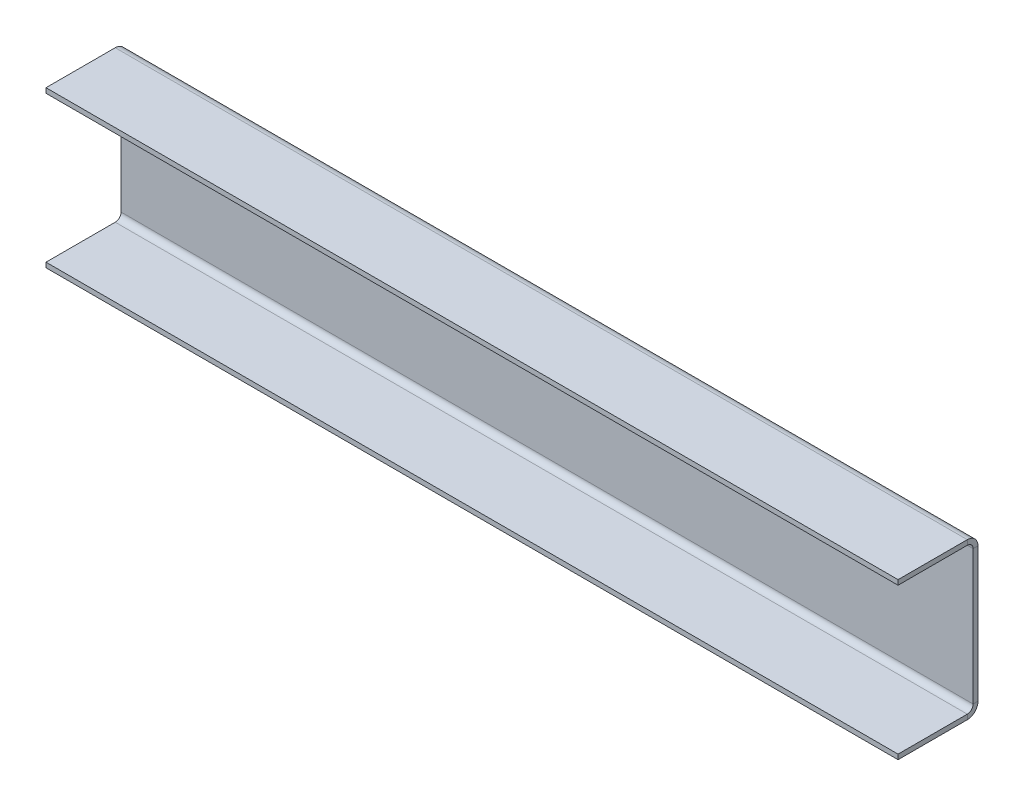
ISO-10303-21;
HEADER;
FILE_DESCRIPTION(('STEP AP214'),'2;1');
FILE_NAME('part.step','',(''),(''),'','','');
FILE_SCHEMA(('AUTOMOTIVE_DESIGN { 1 0 10303 214 1 1 1 1 }'));
ENDSEC;
DATA;
#1=APPLICATION_CONTEXT('core data for automotive mechanical design processes');
#2=APPLICATION_PROTOCOL_DEFINITION('international standard','automotive_design',2000,#1);
#3=PRODUCT_CONTEXT('',#1,'mechanical');
#4=PRODUCT('Part','Part','',(#3));
#5=PRODUCT_RELATED_PRODUCT_CATEGORY('part','',(#4));
#6=PRODUCT_DEFINITION_FORMATION('','',#4);
#7=PRODUCT_DEFINITION_CONTEXT('part definition',#1,'design');
#8=PRODUCT_DEFINITION('design','',#6,#7);
#9=PRODUCT_DEFINITION_SHAPE('','',#8);
#10=(LENGTH_UNIT() NAMED_UNIT(*) SI_UNIT(.MILLI.,.METRE.));
#11=(NAMED_UNIT(*) PLANE_ANGLE_UNIT() SI_UNIT($,.RADIAN.));
#12=(NAMED_UNIT(*) SI_UNIT($,.STERADIAN.) SOLID_ANGLE_UNIT());
#13=UNCERTAINTY_MEASURE_WITH_UNIT(LENGTH_MEASURE(1.E-05),#10,'distance_accuracy_value','');
#14=(GEOMETRIC_REPRESENTATION_CONTEXT(3) GLOBAL_UNCERTAINTY_ASSIGNED_CONTEXT((#13)) GLOBAL_UNIT_ASSIGNED_CONTEXT((#10,
#11,#12)) REPRESENTATION_CONTEXT('',''));
#15=CARTESIAN_POINT('',(0.,0.,0.));
#16=DIRECTION('',(0.,0.,1.));
#17=DIRECTION('',(1.,0.,0.));
#18=AXIS2_PLACEMENT_3D('',#15,#16,#17);
#19=CARTESIAN_POINT('',(0.,0.,-2.5));
#20=DIRECTION('',(0.,0.,1.));
#21=DIRECTION('',(1.,0.,0.));
#22=AXIS2_PLACEMENT_3D('',#19,#20,#21);
#23=PLANE('',#22);
#24=DIRECTION('',(1.,0.,0.));
#25=VECTOR('',#24,1.);
#26=CARTESIAN_POINT('',(218.5,-34.5,-2.50000000000002));
#27=LINE('',#26,#25);
#28=CARTESIAN_POINT('',(218.5,-34.5,-2.50000000000002));
#29=VERTEX_POINT('',#28);
#30=CARTESIAN_POINT('',(-218.5,-34.5,-2.5));
#31=VERTEX_POINT('',#30);
#32=EDGE_CURVE('E212',#29,#31,#27,.F.);
#33=ORIENTED_EDGE('',*,*,#32,.T.);
#34=DIRECTION('',(0.,-1.,0.));
#35=VECTOR('',#34,1.);
#36=CARTESIAN_POINT('',(-218.5,-40.,-2.5));
#37=LINE('',#36,#35);
#38=CARTESIAN_POINT('',(-218.5,34.5,-2.50000000000004));
#39=VERTEX_POINT('',#38);
#40=EDGE_CURVE('E89',#39,#31,#37,.T.);
#41=ORIENTED_EDGE('',*,*,#40,.F.);
#42=DIRECTION('',(-1.,0.,0.));
#43=VECTOR('',#42,1.);
#44=CARTESIAN_POINT('',(-218.5,34.5,-2.50000000000004));
#45=LINE('',#44,#43);
#46=CARTESIAN_POINT('',(218.5,34.5,-2.5));
#47=VERTEX_POINT('',#46);
#48=EDGE_CURVE('E265',#39,#47,#45,.F.);
#49=ORIENTED_EDGE('',*,*,#48,.T.);
#50=DIRECTION('',(0.,1.,0.));
#51=VECTOR('',#50,1.);
#52=CARTESIAN_POINT('',(218.5,-40.,-2.5));
#53=LINE('',#52,#51);
#54=EDGE_CURVE('E13',#29,#47,#53,.T.);
#55=ORIENTED_EDGE('',*,*,#54,.F.);
#56=EDGE_LOOP('',(#33,#41,#49,#55));
#57=FACE_BOUND('',#56,.T.);
#58=ADVANCED_FACE('F80',(#57),#23,.F.);
#59=CARTESIAN_POINT('',(0.,0.,0.));
#60=DIRECTION('',(0.,0.,1.));
#61=DIRECTION('',(1.,0.,0.));
#62=AXIS2_PLACEMENT_3D('',#59,#60,#61);
#63=PLANE('',#62);
#64=DIRECTION('',(0.,-1.,0.));
#65=VECTOR('',#64,1.);
#66=CARTESIAN_POINT('',(-218.5,-40.,0.));
#67=LINE('',#66,#65);
#68=CARTESIAN_POINT('',(-218.5,34.5,0.));
#69=VERTEX_POINT('',#68);
#70=CARTESIAN_POINT('',(-218.5,-34.5,0.));
#71=VERTEX_POINT('',#70);
#72=EDGE_CURVE('E283',#69,#71,#67,.T.);
#73=ORIENTED_EDGE('',*,*,#72,.T.);
#74=DIRECTION('',(1.,0.,0.));
#75=VECTOR('',#74,1.);
#76=CARTESIAN_POINT('',(218.5,-34.5,0.));
#77=LINE('',#76,#75);
#78=CARTESIAN_POINT('',(218.5,-34.5,0.));
#79=VERTEX_POINT('',#78);
#80=EDGE_CURVE('E224',#79,#71,#77,.F.);
#81=ORIENTED_EDGE('',*,*,#80,.F.);
#82=DIRECTION('',(0.,1.,0.));
#83=VECTOR('',#82,1.);
#84=CARTESIAN_POINT('',(218.5,-40.,0.));
#85=LINE('',#84,#83);
#86=CARTESIAN_POINT('',(218.5,34.5,0.));
#87=VERTEX_POINT('',#86);
#88=EDGE_CURVE('E84',#79,#87,#85,.T.);
#89=ORIENTED_EDGE('',*,*,#88,.T.);
#90=DIRECTION('',(-1.,0.,0.));
#91=VECTOR('',#90,1.);
#92=CARTESIAN_POINT('',(-218.5,34.5,0.));
#93=LINE('',#92,#91);
#94=EDGE_CURVE('E97',#69,#87,#93,.F.);
#95=ORIENTED_EDGE('',*,*,#94,.F.);
#96=EDGE_LOOP('',(#73,#81,#89,#95));
#97=FACE_BOUND('',#96,.T.);
#98=ADVANCED_FACE('F288',(#97),#63,.T.);
#99=CARTESIAN_POINT('',(218.5,-40.,-2.5));
#100=DIRECTION('',(1.,0.,0.));
#101=DIRECTION('',(0.,0.,-1.));
#102=AXIS2_PLACEMENT_3D('',#99,#100,#101);
#103=PLANE('',#102);
#104=ORIENTED_EDGE('',*,*,#88,.F.);
#105=DIRECTION('',(0.,0.,-1.));
#106=VECTOR('',#105,1.);
#107=CARTESIAN_POINT('',(218.5,-34.5,0.));
#108=LINE('',#107,#106);
#109=EDGE_CURVE('E218',#79,#29,#108,.T.);
#110=ORIENTED_EDGE('',*,*,#109,.T.);
#111=ORIENTED_EDGE('',*,*,#54,.T.);
#112=DIRECTION('',(0.,0.,-1.));
#113=VECTOR('',#112,1.);
#114=CARTESIAN_POINT('',(218.5,34.5,0.));
#115=LINE('',#114,#113);
#116=EDGE_CURVE('E280',#87,#47,#115,.T.);
#117=ORIENTED_EDGE('',*,*,#116,.F.);
#118=EDGE_LOOP('',(#104,#110,#111,#117));
#119=FACE_BOUND('',#118,.T.);
#120=ADVANCED_FACE('F290',(#119),#103,.T.);
#121=CARTESIAN_POINT('',(-218.5,-40.,-2.5));
#122=DIRECTION('',(-1.,0.,0.));
#123=DIRECTION('',(0.,0.,1.));
#124=AXIS2_PLACEMENT_3D('',#121,#122,#123);
#125=PLANE('',#124);
#126=DIRECTION('',(0.,0.,-1.));
#127=VECTOR('',#126,1.);
#128=CARTESIAN_POINT('',(-218.5,-34.5,0.));
#129=LINE('',#128,#127);
#130=EDGE_CURVE('E230',#71,#31,#129,.T.);
#131=ORIENTED_EDGE('',*,*,#130,.F.);
#132=ORIENTED_EDGE('',*,*,#72,.F.);
#133=DIRECTION('',(0.,0.,-1.));
#134=VECTOR('',#133,1.);
#135=CARTESIAN_POINT('',(-218.5,34.5,0.));
#136=LINE('',#135,#134);
#137=EDGE_CURVE('E271',#69,#39,#136,.T.);
#138=ORIENTED_EDGE('',*,*,#137,.T.);
#139=ORIENTED_EDGE('',*,*,#40,.T.);
#140=EDGE_LOOP('',(#131,#132,#138,#139));
#141=FACE_BOUND('',#140,.T.);
#142=ADVANCED_FACE('F82',(#141),#125,.T.);
#143=CARTESIAN_POINT('',(218.5,34.5,3.));
#144=DIRECTION('',(1.,0.,0.));
#145=DIRECTION('',(0.,0.,-1.));
#146=AXIS2_PLACEMENT_3D('',#143,#144,#145);
#147=PLANE('',#146);
#148=DIRECTION('',(0.,-1.,0.));
#149=VECTOR('',#148,1.);
#150=CARTESIAN_POINT('',(218.5,40.,2.99999999999998));
#151=LINE('',#150,#149);
#152=CARTESIAN_POINT('',(218.5,37.5,2.99999999999999));
#153=VERTEX_POINT('',#152);
#154=CARTESIAN_POINT('',(218.5,40.,2.99999999999998));
#155=VERTEX_POINT('',#154);
#156=EDGE_CURVE('E233',#153,#155,#151,.F.);
#157=ORIENTED_EDGE('',*,*,#156,.F.);
#158=CARTESIAN_POINT('',(218.5,34.5,3.));
#159=DIRECTION('',(-1.,0.,0.));
#160=DIRECTION('',(0.,0.,1.));
#161=AXIS2_PLACEMENT_3D('',#158,#159,#160);
#162=CIRCLE('',#161,3.00000000000004);
#163=EDGE_CURVE('E274',#87,#153,#162,.F.);
#164=ORIENTED_EDGE('',*,*,#163,.F.);
#165=ORIENTED_EDGE('',*,*,#116,.T.);
#166=CARTESIAN_POINT('',(218.5,34.5,3.));
#167=DIRECTION('',(-1.,0.,0.));
#168=DIRECTION('',(0.,0.,1.));
#169=AXIS2_PLACEMENT_3D('',#166,#167,#168);
#170=CIRCLE('',#169,5.50000000000004);
#171=EDGE_CURVE('E267',#47,#155,#170,.F.);
#172=ORIENTED_EDGE('',*,*,#171,.T.);
#173=EDGE_LOOP('',(#157,#164,#165,#172));
#174=FACE_BOUND('',#173,.T.);
#175=ADVANCED_FACE('F298',(#174),#147,.T.);
#176=CARTESIAN_POINT('',(-218.5,34.5,3.));
#177=DIRECTION('',(1.,0.,0.));
#178=DIRECTION('',(0.,0.,-1.));
#179=AXIS2_PLACEMENT_3D('',#176,#177,#178);
#180=PLANE('',#179);
#181=CARTESIAN_POINT('',(-218.5,34.5,3.));
#182=DIRECTION('',(-1.,0.,0.));
#183=DIRECTION('',(0.,0.,1.));
#184=AXIS2_PLACEMENT_3D('',#181,#182,#183);
#185=CIRCLE('',#184,3.00000000000004);
#186=CARTESIAN_POINT('',(-218.5,37.5,2.99999999999999));
#187=VERTEX_POINT('',#186);
#188=EDGE_CURVE('E238',#187,#69,#185,.T.);
#189=ORIENTED_EDGE('',*,*,#188,.F.);
#190=DIRECTION('',(0.,-1.,0.));
#191=VECTOR('',#190,1.);
#192=CARTESIAN_POINT('',(-218.5,37.5,2.99999999999999));
#193=LINE('',#192,#191);
#194=CARTESIAN_POINT('',(-218.5,40.,2.99999999999998));
#195=VERTEX_POINT('',#194);
#196=EDGE_CURVE('E258',#187,#195,#193,.F.);
#197=ORIENTED_EDGE('',*,*,#196,.T.);
#198=CARTESIAN_POINT('',(-218.5,34.5,3.));
#199=DIRECTION('',(-1.,0.,0.));
#200=DIRECTION('',(0.,0.,1.));
#201=AXIS2_PLACEMENT_3D('',#198,#199,#200);
#202=CIRCLE('',#201,5.50000000000004);
#203=EDGE_CURVE('E268',#195,#39,#202,.T.);
#204=ORIENTED_EDGE('',*,*,#203,.T.);
#205=ORIENTED_EDGE('',*,*,#137,.F.);
#206=EDGE_LOOP('',(#189,#197,#204,#205));
#207=FACE_BOUND('',#206,.T.);
#208=ADVANCED_FACE('F319',(#207),#180,.F.);
#209=CARTESIAN_POINT('',(-218.5,34.5,3.));
#210=DIRECTION('',(-1.,0.,0.));
#211=DIRECTION('',(0.,1.,0.));
#212=AXIS2_PLACEMENT_3D('',#209,#210,#211);
#213=CYLINDRICAL_SURFACE('',#212,5.50000000000004);
#214=ORIENTED_EDGE('',*,*,#48,.F.);
#215=ORIENTED_EDGE('',*,*,#203,.F.);
#216=DIRECTION('',(-1.,0.,0.));
#217=VECTOR('',#216,1.);
#218=CARTESIAN_POINT('',(218.5,40.,2.99999999999998));
#219=LINE('',#218,#217);
#220=EDGE_CURVE('E256',#195,#155,#219,.F.);
#221=ORIENTED_EDGE('',*,*,#220,.T.);
#222=ORIENTED_EDGE('',*,*,#171,.F.);
#223=EDGE_LOOP('',(#214,#215,#221,#222));
#224=FACE_BOUND('',#223,.T.);
#225=ADVANCED_FACE('F498',(#224),#213,.T.);
#226=CARTESIAN_POINT('',(-218.5,34.5,3.));
#227=DIRECTION('',(-1.,0.,0.));
#228=DIRECTION('',(0.,1.,0.));
#229=AXIS2_PLACEMENT_3D('',#226,#227,#228);
#230=CYLINDRICAL_SURFACE('',#229,3.00000000000004);
#231=ORIENTED_EDGE('',*,*,#94,.T.);
#232=ORIENTED_EDGE('',*,*,#163,.T.);
#233=DIRECTION('',(-1.,0.,0.));
#234=VECTOR('',#233,1.);
#235=CARTESIAN_POINT('',(218.5,37.5,2.99999999999999));
#236=LINE('',#235,#234);
#237=EDGE_CURVE('E261',#153,#187,#236,.T.);
#238=ORIENTED_EDGE('',*,*,#237,.T.);
#239=ORIENTED_EDGE('',*,*,#188,.T.);
#240=EDGE_LOOP('',(#231,#232,#238,#239));
#241=FACE_BOUND('',#240,.T.);
#242=ADVANCED_FACE('F295',(#241),#230,.F.);
#243=CARTESIAN_POINT('',(218.5,40.,0.));
#244=DIRECTION('',(-1.,0.,0.));
#245=DIRECTION('',(0.,0.,1.));
#246=AXIS2_PLACEMENT_3D('',#243,#244,#245);
#247=PLANE('',#246);
#248=ORIENTED_EDGE('',*,*,#156,.T.);
#249=DIRECTION('',(0.,0.,-1.));
#250=VECTOR('',#249,1.);
#251=CARTESIAN_POINT('',(218.5,40.,-6.18269980827997E-13));
#252=LINE('',#251,#250);
#253=CARTESIAN_POINT('',(218.5,40.0000000000002,38.5));
#254=VERTEX_POINT('',#253);
#255=EDGE_CURVE('E246',#254,#155,#252,.T.);
#256=ORIENTED_EDGE('',*,*,#255,.F.);
#257=DIRECTION('',(0.,-1.,0.));
#258=VECTOR('',#257,1.);
#259=CARTESIAN_POINT('',(218.5,40.0000000000002,38.5));
#260=LINE('',#259,#258);
#261=CARTESIAN_POINT('',(218.5,37.5000000000002,38.5));
#262=VERTEX_POINT('',#261);
#263=EDGE_CURVE('E239',#254,#262,#260,.T.);
#264=ORIENTED_EDGE('',*,*,#263,.T.);
#265=DIRECTION('',(0.,0.,1.));
#266=VECTOR('',#265,1.);
#267=CARTESIAN_POINT('',(218.5,37.5,0.));
#268=LINE('',#267,#266);
#269=EDGE_CURVE('E253',#262,#153,#268,.F.);
#270=ORIENTED_EDGE('',*,*,#269,.T.);
#271=EDGE_LOOP('',(#248,#256,#264,#270));
#272=FACE_BOUND('',#271,.T.);
#273=ADVANCED_FACE('F301',(#272),#247,.F.);
#274=CARTESIAN_POINT('',(-218.5,40.0000000000001,38.5));
#275=DIRECTION('',(1.,0.,0.));
#276=DIRECTION('',(0.,0.,-1.));
#277=AXIS2_PLACEMENT_3D('',#274,#275,#276);
#278=PLANE('',#277);
#279=ORIENTED_EDGE('',*,*,#196,.F.);
#280=DIRECTION('',(0.,0.,-1.));
#281=VECTOR('',#280,1.);
#282=CARTESIAN_POINT('',(-218.5,37.5000000000001,38.5));
#283=LINE('',#282,#281);
#284=CARTESIAN_POINT('',(-218.5,37.5000000000001,38.5));
#285=VERTEX_POINT('',#284);
#286=EDGE_CURVE('E251',#187,#285,#283,.F.);
#287=ORIENTED_EDGE('',*,*,#286,.T.);
#288=DIRECTION('',(0.,-1.,0.));
#289=VECTOR('',#288,1.);
#290=CARTESIAN_POINT('',(-218.5,40.0000000000001,38.5));
#291=LINE('',#290,#289);
#292=CARTESIAN_POINT('',(-218.5,40.0000000000001,38.5));
#293=VERTEX_POINT('',#292);
#294=EDGE_CURVE('E235',#293,#285,#291,.T.);
#295=ORIENTED_EDGE('',*,*,#294,.F.);
#296=DIRECTION('',(0.,0.,1.));
#297=VECTOR('',#296,1.);
#298=CARTESIAN_POINT('',(-218.5,40.,3.26861438187315E-13));
#299=LINE('',#298,#297);
#300=EDGE_CURVE('E244',#195,#293,#299,.T.);
#301=ORIENTED_EDGE('',*,*,#300,.F.);
#302=EDGE_LOOP('',(#279,#287,#295,#301));
#303=FACE_BOUND('',#302,.T.);
#304=ADVANCED_FACE('F321',(#303),#278,.F.);
#305=CARTESIAN_POINT('',(0.,40.,-1.45704271320341E-13));
#306=DIRECTION('',(0.,-1.,0.));
#307=DIRECTION('',(0.,0.,-1.));
#308=AXIS2_PLACEMENT_3D('',#305,#306,#307);
#309=PLANE('',#308);
#310=ORIENTED_EDGE('',*,*,#220,.F.);
#311=ORIENTED_EDGE('',*,*,#300,.T.);
#312=DIRECTION('',(1.,0.,0.));
#313=VECTOR('',#312,1.);
#314=CARTESIAN_POINT('',(0.,40.0000000000001,38.5));
#315=LINE('',#314,#313);
#316=EDGE_CURVE('E242',#293,#254,#315,.T.);
#317=ORIENTED_EDGE('',*,*,#316,.T.);
#318=ORIENTED_EDGE('',*,*,#255,.T.);
#319=EDGE_LOOP('',(#310,#311,#317,#318));
#320=FACE_BOUND('',#319,.T.);
#321=ADVANCED_FACE('F305',(#320),#309,.F.);
#322=CARTESIAN_POINT('',(0.,37.5,-1.36975567973234E-13));
#323=DIRECTION('',(0.,-1.,0.));
#324=DIRECTION('',(0.,0.,-1.));
#325=AXIS2_PLACEMENT_3D('',#322,#323,#324);
#326=PLANE('',#325);
#327=ORIENTED_EDGE('',*,*,#286,.F.);
#328=ORIENTED_EDGE('',*,*,#237,.F.);
#329=ORIENTED_EDGE('',*,*,#269,.F.);
#330=DIRECTION('',(-1.,0.,0.));
#331=VECTOR('',#330,1.);
#332=CARTESIAN_POINT('',(218.5,37.5000000000002,38.5));
#333=LINE('',#332,#331);
#334=EDGE_CURVE('E249',#285,#262,#333,.F.);
#335=ORIENTED_EDGE('',*,*,#334,.F.);
#336=EDGE_LOOP('',(#327,#328,#329,#335));
#337=FACE_BOUND('',#336,.T.);
#338=ADVANCED_FACE('F315',(#337),#326,.T.);
#339=CARTESIAN_POINT('',(218.5,40.0000000000002,38.5));
#340=DIRECTION('',(0.,0.,-1.));
#341=DIRECTION('',(0.,1.,0.));
#342=AXIS2_PLACEMENT_3D('',#339,#340,#341);
#343=PLANE('',#342);
#344=ORIENTED_EDGE('',*,*,#334,.T.);
#345=ORIENTED_EDGE('',*,*,#263,.F.);
#346=ORIENTED_EDGE('',*,*,#316,.F.);
#347=ORIENTED_EDGE('',*,*,#294,.T.);
#348=EDGE_LOOP('',(#344,#345,#346,#347));
#349=FACE_BOUND('',#348,.T.);
#350=ADVANCED_FACE('F311',(#349),#343,.F.);
#351=CARTESIAN_POINT('',(-218.5,-34.5,3.00000000000001));
#352=DIRECTION('',(-1.,0.,0.));
#353=DIRECTION('',(0.,0.,1.));
#354=AXIS2_PLACEMENT_3D('',#351,#352,#353);
#355=PLANE('',#354);
#356=DIRECTION('',(0.,1.,0.));
#357=VECTOR('',#356,1.);
#358=CARTESIAN_POINT('',(-218.5,-40.,2.99999999999998));
#359=LINE('',#358,#357);
#360=CARTESIAN_POINT('',(-218.5,-37.5,3.));
#361=VERTEX_POINT('',#360);
#362=CARTESIAN_POINT('',(-218.5,-40.,2.99999999999999));
#363=VERTEX_POINT('',#362);
#364=EDGE_CURVE('E195',#361,#363,#359,.F.);
#365=ORIENTED_EDGE('',*,*,#364,.F.);
#366=CARTESIAN_POINT('',(-218.5,-34.5,3.00000000000001));
#367=DIRECTION('',(1.,0.,0.));
#368=DIRECTION('',(0.,0.,-1.));
#369=AXIS2_PLACEMENT_3D('',#366,#367,#368);
#370=CIRCLE('',#369,3.00000000000003);
#371=EDGE_CURVE('E221',#71,#361,#370,.F.);
#372=ORIENTED_EDGE('',*,*,#371,.F.);
#373=ORIENTED_EDGE('',*,*,#130,.T.);
#374=CARTESIAN_POINT('',(-218.5,-34.5,3.00000000000001));
#375=DIRECTION('',(1.,0.,0.));
#376=DIRECTION('',(0.,0.,-1.));
#377=AXIS2_PLACEMENT_3D('',#374,#375,#376);
#378=CIRCLE('',#377,5.50000000000003);
#379=EDGE_CURVE('E214',#31,#363,#378,.F.);
#380=ORIENTED_EDGE('',*,*,#379,.T.);
#381=EDGE_LOOP('',(#365,#372,#373,#380));
#382=FACE_BOUND('',#381,.T.);
#383=ADVANCED_FACE('F351',(#382),#355,.T.);
#384=CARTESIAN_POINT('',(218.5,-34.5,3.00000000000001));
#385=DIRECTION('',(-1.,0.,0.));
#386=DIRECTION('',(0.,0.,1.));
#387=AXIS2_PLACEMENT_3D('',#384,#385,#386);
#388=PLANE('',#387);
#389=CARTESIAN_POINT('',(218.5,-34.5,3.00000000000001));
#390=DIRECTION('',(1.,0.,0.));
#391=DIRECTION('',(0.,0.,-1.));
#392=AXIS2_PLACEMENT_3D('',#389,#390,#391);
#393=CIRCLE('',#392,3.00000000000003);
#394=CARTESIAN_POINT('',(218.5,-37.5,3.));
#395=VERTEX_POINT('',#394);
#396=EDGE_CURVE('E227',#395,#79,#393,.T.);
#397=ORIENTED_EDGE('',*,*,#396,.F.);
#398=DIRECTION('',(0.,1.,0.));
#399=VECTOR('',#398,1.);
#400=CARTESIAN_POINT('',(218.5,-37.5,3.));
#401=LINE('',#400,#399);
#402=CARTESIAN_POINT('',(218.5,-40.,2.99999999999999));
#403=VERTEX_POINT('',#402);
#404=EDGE_CURVE('E206',#395,#403,#401,.F.);
#405=ORIENTED_EDGE('',*,*,#404,.T.);
#406=CARTESIAN_POINT('',(218.5,-34.5,3.00000000000001));
#407=DIRECTION('',(1.,0.,0.));
#408=DIRECTION('',(0.,0.,-1.));
#409=AXIS2_PLACEMENT_3D('',#406,#407,#408);
#410=CIRCLE('',#409,5.50000000000003);
#411=EDGE_CURVE('E215',#403,#29,#410,.T.);
#412=ORIENTED_EDGE('',*,*,#411,.T.);
#413=ORIENTED_EDGE('',*,*,#109,.F.);
#414=EDGE_LOOP('',(#397,#405,#412,#413));
#415=FACE_BOUND('',#414,.T.);
#416=ADVANCED_FACE('F367',(#415),#388,.F.);
#417=CARTESIAN_POINT('',(218.5,-34.5,3.00000000000001));
#418=DIRECTION('',(1.,0.,0.));
#419=DIRECTION('',(0.,-1.,0.));
#420=AXIS2_PLACEMENT_3D('',#417,#418,#419);
#421=CYLINDRICAL_SURFACE('',#420,5.50000000000003);
#422=ORIENTED_EDGE('',*,*,#32,.F.);
#423=ORIENTED_EDGE('',*,*,#411,.F.);
#424=DIRECTION('',(1.,0.,0.));
#425=VECTOR('',#424,1.);
#426=CARTESIAN_POINT('',(-218.5,-40.,2.99999999999998));
#427=LINE('',#426,#425);
#428=EDGE_CURVE('E204',#403,#363,#427,.F.);
#429=ORIENTED_EDGE('',*,*,#428,.T.);
#430=ORIENTED_EDGE('',*,*,#379,.F.);
#431=EDGE_LOOP('',(#422,#423,#429,#430));
#432=FACE_BOUND('',#431,.T.);
#433=ADVANCED_FACE('F354',(#432),#421,.T.);
#434=CARTESIAN_POINT('',(218.5,-34.5,3.00000000000001));
#435=DIRECTION('',(1.,0.,0.));
#436=DIRECTION('',(0.,-1.,0.));
#437=AXIS2_PLACEMENT_3D('',#434,#435,#436);
#438=CYLINDRICAL_SURFACE('',#437,3.00000000000003);
#439=ORIENTED_EDGE('',*,*,#80,.T.);
#440=ORIENTED_EDGE('',*,*,#371,.T.);
#441=DIRECTION('',(1.,0.,0.));
#442=VECTOR('',#441,1.);
#443=CARTESIAN_POINT('',(-218.5,-37.5,2.99999999999999));
#444=LINE('',#443,#442);
#445=EDGE_CURVE('E209',#361,#395,#444,.T.);
#446=ORIENTED_EDGE('',*,*,#445,.T.);
#447=ORIENTED_EDGE('',*,*,#396,.T.);
#448=EDGE_LOOP('',(#439,#440,#446,#447));
#449=FACE_BOUND('',#448,.T.);
#450=ADVANCED_FACE('F365',(#449),#438,.F.);
#451=CARTESIAN_POINT('',(-218.5,-40.,0.));
#452=DIRECTION('',(1.,0.,0.));
#453=DIRECTION('',(0.,0.,-1.));
#454=AXIS2_PLACEMENT_3D('',#451,#452,#453);
#455=PLANE('',#454);
#456=ORIENTED_EDGE('',*,*,#364,.T.);
#457=DIRECTION('',(0.,0.,-1.));
#458=VECTOR('',#457,1.);
#459=CARTESIAN_POINT('',(-218.5,-40.,3.26861438187314E-13));
#460=LINE('',#459,#458);
#461=CARTESIAN_POINT('',(-218.5,-40.0000000000002,38.5));
#462=VERTEX_POINT('',#461);
#463=EDGE_CURVE('E176',#462,#363,#460,.T.);
#464=ORIENTED_EDGE('',*,*,#463,.F.);
#465=DIRECTION('',(0.,1.,0.));
#466=VECTOR('',#465,1.);
#467=CARTESIAN_POINT('',(-218.5,-40.0000000000002,38.5));
#468=LINE('',#467,#466);
#469=CARTESIAN_POINT('',(-218.5,-37.5000000000002,38.5));
#470=VERTEX_POINT('',#469);
#471=EDGE_CURVE('E182',#462,#470,#468,.T.);
#472=ORIENTED_EDGE('',*,*,#471,.T.);
#473=DIRECTION('',(0.,0.,1.));
#474=VECTOR('',#473,1.);
#475=CARTESIAN_POINT('',(-218.5,-37.5,0.));
#476=LINE('',#475,#474);
#477=EDGE_CURVE('E202',#470,#361,#476,.F.);
#478=ORIENTED_EDGE('',*,*,#477,.T.);
#479=EDGE_LOOP('',(#456,#464,#472,#478));
#480=FACE_BOUND('',#479,.T.);
#481=ADVANCED_FACE('F194',(#480),#455,.F.);
#482=CARTESIAN_POINT('',(218.5,-40.0000000000001,38.5));
#483=DIRECTION('',(-1.,0.,0.));
#484=DIRECTION('',(0.,0.,1.));
#485=AXIS2_PLACEMENT_3D('',#482,#483,#484);
#486=PLANE('',#485);
#487=ORIENTED_EDGE('',*,*,#404,.F.);
#488=DIRECTION('',(0.,0.,-1.));
#489=VECTOR('',#488,1.);
#490=CARTESIAN_POINT('',(218.5,-37.5000000000001,38.5));
#491=LINE('',#490,#489);
#492=CARTESIAN_POINT('',(218.5,-37.5000000000001,38.5));
#493=VERTEX_POINT('',#492);
#494=EDGE_CURVE('E198',#395,#493,#491,.F.);
#495=ORIENTED_EDGE('',*,*,#494,.T.);
#496=DIRECTION('',(0.,1.,0.));
#497=VECTOR('',#496,1.);
#498=CARTESIAN_POINT('',(218.5,-40.0000000000001,38.5));
#499=LINE('',#498,#497);
#500=CARTESIAN_POINT('',(218.5,-40.0000000000001,38.5));
#501=VERTEX_POINT('',#500);
#502=EDGE_CURVE('E191',#501,#493,#499,.T.);
#503=ORIENTED_EDGE('',*,*,#502,.F.);
#504=DIRECTION('',(0.,0.,1.));
#505=VECTOR('',#504,1.);
#506=CARTESIAN_POINT('',(218.5,-40.,-6.18269980827997E-13));
#507=LINE('',#506,#505);
#508=EDGE_CURVE('E178',#403,#501,#507,.T.);
#509=ORIENTED_EDGE('',*,*,#508,.F.);
#510=EDGE_LOOP('',(#487,#495,#503,#509));
#511=FACE_BOUND('',#510,.T.);
#512=ADVANCED_FACE('F357',(#511),#486,.F.);
#513=CARTESIAN_POINT('',(0.,-40.,-1.45704271320341E-13));
#514=DIRECTION('',(0.,1.,0.));
#515=DIRECTION('',(0.,0.,1.));
#516=AXIS2_PLACEMENT_3D('',#513,#514,#515);
#517=PLANE('',#516);
#518=ORIENTED_EDGE('',*,*,#428,.F.);
#519=ORIENTED_EDGE('',*,*,#508,.T.);
#520=DIRECTION('',(-1.,0.,0.));
#521=VECTOR('',#520,1.);
#522=CARTESIAN_POINT('',(0.,-40.0000000000001,38.5));
#523=LINE('',#522,#521);
#524=EDGE_CURVE('E171',#501,#462,#523,.T.);
#525=ORIENTED_EDGE('',*,*,#524,.T.);
#526=ORIENTED_EDGE('',*,*,#463,.T.);
#527=EDGE_LOOP('',(#518,#519,#525,#526));
#528=FACE_BOUND('',#527,.T.);
#529=ADVANCED_FACE('F174',(#528),#517,.F.);
#530=CARTESIAN_POINT('',(0.,-37.5,-1.36975567973234E-13));
#531=DIRECTION('',(0.,1.,0.));
#532=DIRECTION('',(0.,0.,1.));
#533=AXIS2_PLACEMENT_3D('',#530,#531,#532);
#534=PLANE('',#533);
#535=ORIENTED_EDGE('',*,*,#494,.F.);
#536=ORIENTED_EDGE('',*,*,#445,.F.);
#537=ORIENTED_EDGE('',*,*,#477,.F.);
#538=DIRECTION('',(1.,0.,0.));
#539=VECTOR('',#538,1.);
#540=CARTESIAN_POINT('',(-218.5,-37.5000000000002,38.5));
#541=LINE('',#540,#539);
#542=EDGE_CURVE('E187',#493,#470,#541,.F.);
#543=ORIENTED_EDGE('',*,*,#542,.F.);
#544=EDGE_LOOP('',(#535,#536,#537,#543));
#545=FACE_BOUND('',#544,.T.);
#546=ADVANCED_FACE('F361',(#545),#534,.T.);
#547=CARTESIAN_POINT('',(-218.5,-40.0000000000002,38.5));
#548=DIRECTION('',(0.,0.,-1.));
#549=DIRECTION('',(0.,1.,0.));
#550=AXIS2_PLACEMENT_3D('',#547,#548,#549);
#551=PLANE('',#550);
#552=ORIENTED_EDGE('',*,*,#542,.T.);
#553=ORIENTED_EDGE('',*,*,#471,.F.);
#554=ORIENTED_EDGE('',*,*,#524,.F.);
#555=ORIENTED_EDGE('',*,*,#502,.T.);
#556=EDGE_LOOP('',(#552,#553,#554,#555));
#557=FACE_BOUND('',#556,.T.);
#558=ADVANCED_FACE('F185',(#557),#551,.F.);
#559=CLOSED_SHELL('',(#58,#98,#120,#142,#175,#208,#225,#242,#273,#304,#321,#338,#350,#383,#416,
#433,#450,#481,#512,#529,#546,#558));
#560=MANIFOLD_SOLID_BREP('B2',#559);
#561=ADVANCED_BREP_SHAPE_REPRESENTATION('',(#18,#560),#14);
#562=SHAPE_DEFINITION_REPRESENTATION(#9,#561);
ENDSEC;
END-ISO-10303-21;
